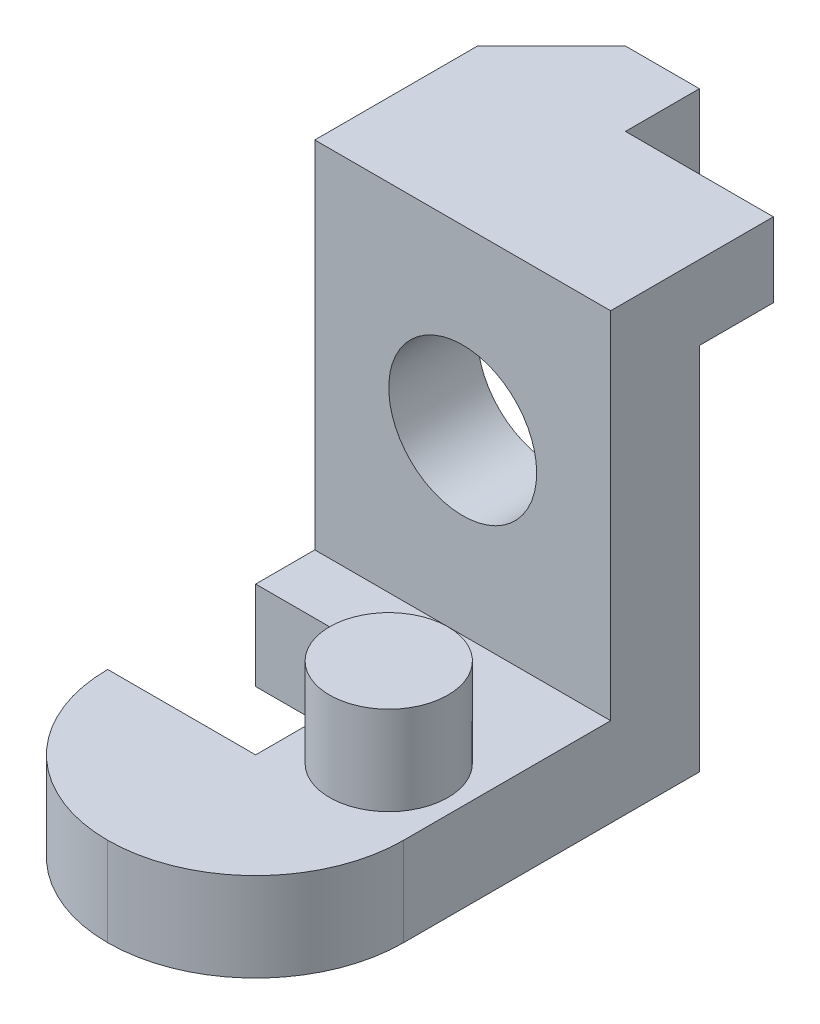
ISO-10303-21;
HEADER;
FILE_DESCRIPTION(('STEP AP214'),'2;1');
FILE_NAME('part.step','',(''),(''),'','','');
FILE_SCHEMA(('AUTOMOTIVE_DESIGN { 1 0 10303 214 1 1 1 1 }'));
ENDSEC;
DATA;
#1=APPLICATION_CONTEXT('core data for automotive mechanical design processes');
#2=APPLICATION_PROTOCOL_DEFINITION('international standard','automotive_design',2000,#1);
#3=PRODUCT_CONTEXT('',#1,'mechanical');
#4=PRODUCT('Part','Part','',(#3));
#5=PRODUCT_RELATED_PRODUCT_CATEGORY('part','',(#4));
#6=PRODUCT_DEFINITION_FORMATION('','',#4);
#7=PRODUCT_DEFINITION_CONTEXT('part definition',#1,'design');
#8=PRODUCT_DEFINITION('design','',#6,#7);
#9=PRODUCT_DEFINITION_SHAPE('','',#8);
#10=(LENGTH_UNIT() NAMED_UNIT(*) SI_UNIT(.MILLI.,.METRE.));
#11=(NAMED_UNIT(*) PLANE_ANGLE_UNIT() SI_UNIT($,.RADIAN.));
#12=(NAMED_UNIT(*) SI_UNIT($,.STERADIAN.) SOLID_ANGLE_UNIT());
#13=UNCERTAINTY_MEASURE_WITH_UNIT(LENGTH_MEASURE(1.E-05),#10,'distance_accuracy_value','');
#14=(GEOMETRIC_REPRESENTATION_CONTEXT(3) GLOBAL_UNCERTAINTY_ASSIGNED_CONTEXT((#13)) GLOBAL_UNIT_ASSIGNED_CONTEXT((#10,
#11,#12)) REPRESENTATION_CONTEXT('',''));
#15=CARTESIAN_POINT('',(0.,0.,0.));
#16=DIRECTION('',(0.,0.,1.));
#17=DIRECTION('',(1.,0.,0.));
#18=AXIS2_PLACEMENT_3D('',#15,#16,#17);
#19=CARTESIAN_POINT('',(12.7,38.1,-12.7));
#20=DIRECTION('',(0.,1.,0.));
#21=DIRECTION('',(0.,0.,1.));
#22=AXIS2_PLACEMENT_3D('',#19,#20,#21);
#23=CYLINDRICAL_SURFACE('',#22,12.7);
#24=DIRECTION('',(0.,1.,0.));
#25=VECTOR('',#24,1.);
#26=CARTESIAN_POINT('',(0.,38.1,-12.7));
#27=LINE('',#26,#25);
#28=CARTESIAN_POINT('',(0.,0.,-12.7));
#29=VERTEX_POINT('',#28);
#30=CARTESIAN_POINT('',(0.,7.62000000000001,-12.7));
#31=VERTEX_POINT('',#30);
#32=EDGE_CURVE('E56',#29,#31,#27,.T.);
#33=ORIENTED_EDGE('',*,*,#32,.F.);
#34=CARTESIAN_POINT('',(12.7,0.,-12.7));
#35=DIRECTION('',(0.,-1.,0.));
#36=DIRECTION('',(0.,0.,-1.));
#37=AXIS2_PLACEMENT_3D('',#34,#35,#36);
#38=CIRCLE('',#37,12.7);
#39=CARTESIAN_POINT('',(12.7,0.,0.));
#40=VERTEX_POINT('',#39);
#41=EDGE_CURVE('E160',#40,#29,#38,.T.);
#42=ORIENTED_EDGE('',*,*,#41,.F.);
#43=DIRECTION('',(0.,1.,0.));
#44=VECTOR('',#43,1.);
#45=CARTESIAN_POINT('',(12.7,38.1,0.));
#46=LINE('',#45,#44);
#47=CARTESIAN_POINT('',(12.7,7.62000000000001,0.));
#48=VERTEX_POINT('',#47);
#49=EDGE_CURVE('E183',#40,#48,#46,.T.);
#50=ORIENTED_EDGE('',*,*,#49,.T.);
#51=CARTESIAN_POINT('',(12.7,7.62000000000001,-12.7));
#52=DIRECTION('',(0.,-1.,0.));
#53=DIRECTION('',(0.,0.,-1.));
#54=AXIS2_PLACEMENT_3D('',#51,#52,#53);
#55=CIRCLE('',#54,12.7);
#56=EDGE_CURVE('E49',#31,#48,#55,.F.);
#57=ORIENTED_EDGE('',*,*,#56,.F.);
#58=EDGE_LOOP('',(#33,#42,#50,#57));
#59=FACE_BOUND('',#58,.T.);
#60=ADVANCED_FACE('F41',(#59),#23,.T.);
#61=CARTESIAN_POINT('',(12.7,38.1,-12.7));
#62=DIRECTION('',(0.,1.,0.));
#63=DIRECTION('',(0.,0.,1.));
#64=AXIS2_PLACEMENT_3D('',#61,#62,#63);
#65=CYLINDRICAL_SURFACE('',#64,12.7);
#66=ORIENTED_EDGE('',*,*,#49,.F.);
#67=CARTESIAN_POINT('',(12.7,0.,-12.7));
#68=DIRECTION('',(0.,-1.,0.));
#69=DIRECTION('',(0.,0.,-1.));
#70=AXIS2_PLACEMENT_3D('',#67,#68,#69);
#71=CIRCLE('',#70,12.7);
#72=CARTESIAN_POINT('',(25.4,0.,-12.7));
#73=VERTEX_POINT('',#72);
#74=EDGE_CURVE('E64',#73,#40,#71,.T.);
#75=ORIENTED_EDGE('',*,*,#74,.F.);
#76=DIRECTION('',(0.,1.,0.));
#77=VECTOR('',#76,1.);
#78=CARTESIAN_POINT('',(25.4,38.1,-12.7));
#79=LINE('',#78,#77);
#80=CARTESIAN_POINT('',(25.4,7.62000000000001,-12.7));
#81=VERTEX_POINT('',#80);
#82=EDGE_CURVE('E184',#81,#73,#79,.F.);
#83=ORIENTED_EDGE('',*,*,#82,.F.);
#84=CARTESIAN_POINT('',(12.7,7.62000000000001,-12.7));
#85=DIRECTION('',(0.,-1.,0.));
#86=DIRECTION('',(0.,0.,-1.));
#87=AXIS2_PLACEMENT_3D('',#84,#85,#86);
#88=CIRCLE('',#87,12.7);
#89=EDGE_CURVE('E170',#48,#81,#88,.F.);
#90=ORIENTED_EDGE('',*,*,#89,.F.);
#91=EDGE_LOOP('',(#66,#75,#83,#90));
#92=FACE_BOUND('',#91,.T.);
#93=ADVANCED_FACE('F182',(#92),#65,.T.);
#94=CARTESIAN_POINT('',(25.4,38.1,-50.8));
#95=DIRECTION('',(1.,0.,0.));
#96=DIRECTION('',(0.,0.,-1.));
#97=AXIS2_PLACEMENT_3D('',#94,#95,#96);
#98=PLANE('',#97);
#99=DIRECTION('',(0.,0.,-1.));
#100=VECTOR('',#99,1.);
#101=CARTESIAN_POINT('',(25.4,7.62000000000001,-30.48));
#102=LINE('',#101,#100);
#103=CARTESIAN_POINT('',(25.4,7.62000000000001,-30.48));
#104=VERTEX_POINT('',#103);
#105=EDGE_CURVE('E249',#81,#104,#102,.T.);
#106=ORIENTED_EDGE('',*,*,#105,.F.);
#107=ORIENTED_EDGE('',*,*,#82,.T.);
#108=DIRECTION('',(0.,0.,1.));
#109=VECTOR('',#108,1.);
#110=CARTESIAN_POINT('',(25.4,0.,-50.8));
#111=LINE('',#110,#109);
#112=CARTESIAN_POINT('',(25.4,0.,-38.1));
#113=VERTEX_POINT('',#112);
#114=EDGE_CURVE('E222',#113,#73,#111,.T.);
#115=ORIENTED_EDGE('',*,*,#114,.F.);
#116=DIRECTION('',(0.,-1.,0.));
#117=VECTOR('',#116,1.);
#118=CARTESIAN_POINT('',(25.4,38.1,-38.1));
#119=LINE('',#118,#117);
#120=CARTESIAN_POINT('',(25.4,31.7068356070592,-38.1));
#121=VERTEX_POINT('',#120);
#122=EDGE_CURVE('E261',#121,#113,#119,.T.);
#123=ORIENTED_EDGE('',*,*,#122,.F.);
#124=DIRECTION('',(0.,0.,1.));
#125=VECTOR('',#124,1.);
#126=CARTESIAN_POINT('',(25.4,31.7068356070592,-50.8));
#127=LINE('',#126,#125);
#128=CARTESIAN_POINT('',(25.4,31.7068356070592,-44.45));
#129=VERTEX_POINT('',#128);
#130=EDGE_CURVE('E250',#129,#121,#127,.T.);
#131=ORIENTED_EDGE('',*,*,#130,.F.);
#132=DIRECTION('',(0.,1.,0.));
#133=VECTOR('',#132,1.);
#134=CARTESIAN_POINT('',(25.4,5.84200000000001,-44.45));
#135=LINE('',#134,#133);
#136=CARTESIAN_POINT('',(25.4,38.1,-44.45));
#137=VERTEX_POINT('',#136);
#138=EDGE_CURVE('E274',#129,#137,#135,.T.);
#139=ORIENTED_EDGE('',*,*,#138,.T.);
#140=DIRECTION('',(0.,0.,1.));
#141=VECTOR('',#140,1.);
#142=CARTESIAN_POINT('',(25.4,38.1,-50.8));
#143=LINE('',#142,#141);
#144=CARTESIAN_POINT('',(25.4,38.1,-30.48));
#145=VERTEX_POINT('',#144);
#146=EDGE_CURVE('E221',#137,#145,#143,.T.);
#147=ORIENTED_EDGE('',*,*,#146,.T.);
#148=DIRECTION('',(0.,1.,0.));
#149=VECTOR('',#148,1.);
#150=CARTESIAN_POINT('',(25.4,7.62000000000001,-30.48));
#151=LINE('',#150,#149);
#152=EDGE_CURVE('E238',#104,#145,#151,.T.);
#153=ORIENTED_EDGE('',*,*,#152,.F.);
#154=EDGE_LOOP('',(#106,#107,#115,#123,#131,#139,#147,#153));
#155=FACE_BOUND('',#154,.T.);
#156=ADVANCED_FACE('F342',(#155),#98,.T.);
#157=CARTESIAN_POINT('',(0.,38.1,-50.8));
#158=DIRECTION('',(0.,0.,-1.));
#159=DIRECTION('',(-1.,0.,0.));
#160=AXIS2_PLACEMENT_3D('',#157,#158,#159);
#161=PLANE('',#160);
#162=DIRECTION('',(1.,0.,0.));
#163=VECTOR('',#162,1.);
#164=CARTESIAN_POINT('',(-10.668,31.7068356070592,-50.8));
#165=LINE('',#164,#163);
#166=CARTESIAN_POINT('',(6.35000000000001,31.7068356070592,-50.8));
#167=VERTEX_POINT('',#166);
#168=CARTESIAN_POINT('',(12.7,31.7068356070592,-50.8));
#169=VERTEX_POINT('',#168);
#170=EDGE_CURVE('E271',#167,#169,#165,.T.);
#171=ORIENTED_EDGE('',*,*,#170,.F.);
#172=DIRECTION('',(0.,1.,0.));
#173=VECTOR('',#172,1.);
#174=CARTESIAN_POINT('',(6.35000000000001,38.1,-50.8));
#175=LINE('',#174,#173);
#176=CARTESIAN_POINT('',(6.35000000000001,38.1,-50.8));
#177=VERTEX_POINT('',#176);
#178=EDGE_CURVE('E192',#167,#177,#175,.T.);
#179=ORIENTED_EDGE('',*,*,#178,.T.);
#180=DIRECTION('',(1.,0.,0.));
#181=VECTOR('',#180,1.);
#182=CARTESIAN_POINT('',(0.,38.1,-50.8));
#183=LINE('',#182,#181);
#184=CARTESIAN_POINT('',(12.7,38.1,-50.8));
#185=VERTEX_POINT('',#184);
#186=EDGE_CURVE('E232',#177,#185,#183,.T.);
#187=ORIENTED_EDGE('',*,*,#186,.T.);
#188=DIRECTION('',(0.,1.,0.));
#189=VECTOR('',#188,1.);
#190=CARTESIAN_POINT('',(12.7,5.84200000000001,-50.8));
#191=LINE('',#190,#189);
#192=EDGE_CURVE('E275',#169,#185,#191,.T.);
#193=ORIENTED_EDGE('',*,*,#192,.F.);
#194=EDGE_LOOP('',(#171,#179,#187,#193));
#195=FACE_BOUND('',#194,.T.);
#196=ADVANCED_FACE('F364',(#195),#161,.T.);
#197=CARTESIAN_POINT('',(0.,38.1,0.));
#198=DIRECTION('',(-1.,0.,0.));
#199=DIRECTION('',(0.,0.,1.));
#200=AXIS2_PLACEMENT_3D('',#197,#198,#199);
#201=PLANE('',#200);
#202=DIRECTION('',(0.,1.,0.));
#203=VECTOR('',#202,1.);
#204=CARTESIAN_POINT('',(0.,0.,-25.4));
#205=LINE('',#204,#203);
#206=CARTESIAN_POINT('',(0.,0.,-25.4));
#207=VERTEX_POINT('',#206);
#208=CARTESIAN_POINT('',(0.,7.62000000000001,-25.4));
#209=VERTEX_POINT('',#208);
#210=EDGE_CURVE('E301',#207,#209,#205,.T.);
#211=ORIENTED_EDGE('',*,*,#210,.T.);
#212=DIRECTION('',(0.,0.,1.));
#213=VECTOR('',#212,1.);
#214=CARTESIAN_POINT('',(0.,7.62000000000001,0.));
#215=LINE('',#214,#213);
#216=CARTESIAN_POINT('',(0.,7.62000000000001,-30.48));
#217=VERTEX_POINT('',#216);
#218=EDGE_CURVE('E242',#217,#209,#215,.T.);
#219=ORIENTED_EDGE('',*,*,#218,.F.);
#220=DIRECTION('',(0.,1.,0.));
#221=VECTOR('',#220,1.);
#222=CARTESIAN_POINT('',(0.,7.62000000000001,-30.48));
#223=LINE('',#222,#221);
#224=CARTESIAN_POINT('',(0.,38.1,-30.48));
#225=VERTEX_POINT('',#224);
#226=EDGE_CURVE('E229',#217,#225,#223,.T.);
#227=ORIENTED_EDGE('',*,*,#226,.T.);
#228=DIRECTION('',(0.,0.,-1.));
#229=VECTOR('',#228,1.);
#230=CARTESIAN_POINT('',(0.,38.1,0.));
#231=LINE('',#230,#229);
#232=CARTESIAN_POINT('',(0.,38.1,-44.45));
#233=VERTEX_POINT('',#232);
#234=EDGE_CURVE('E225',#225,#233,#231,.T.);
#235=ORIENTED_EDGE('',*,*,#234,.T.);
#236=DIRECTION('',(0.,-1.,0.));
#237=VECTOR('',#236,1.);
#238=CARTESIAN_POINT('',(0.,38.1,-44.45));
#239=LINE('',#238,#237);
#240=CARTESIAN_POINT('',(0.,31.7068356070592,-44.45));
#241=VERTEX_POINT('',#240);
#242=EDGE_CURVE('E201',#233,#241,#239,.T.);
#243=ORIENTED_EDGE('',*,*,#242,.T.);
#244=DIRECTION('',(0.,0.,-1.));
#245=VECTOR('',#244,1.);
#246=CARTESIAN_POINT('',(0.,31.7068356070592,0.));
#247=LINE('',#246,#245);
#248=CARTESIAN_POINT('',(0.,31.7068356070592,-38.1));
#249=VERTEX_POINT('',#248);
#250=EDGE_CURVE('E213',#249,#241,#247,.T.);
#251=ORIENTED_EDGE('',*,*,#250,.F.);
#252=DIRECTION('',(0.,1.,0.));
#253=VECTOR('',#252,1.);
#254=CARTESIAN_POINT('',(0.,38.1,-38.1));
#255=LINE('',#254,#253);
#256=CARTESIAN_POINT('',(0.,0.,-38.1));
#257=VERTEX_POINT('',#256);
#258=EDGE_CURVE('E264',#257,#249,#255,.T.);
#259=ORIENTED_EDGE('',*,*,#258,.F.);
#260=DIRECTION('',(0.,0.,-1.));
#261=VECTOR('',#260,1.);
#262=CARTESIAN_POINT('',(0.,0.,0.));
#263=LINE('',#262,#261);
#264=EDGE_CURVE('E226',#207,#257,#263,.T.);
#265=ORIENTED_EDGE('',*,*,#264,.F.);
#266=EDGE_LOOP('',(#211,#219,#227,#235,#243,#251,#259,#265));
#267=FACE_BOUND('',#266,.T.);
#268=ADVANCED_FACE('F334',(#267),#201,.T.);
#269=CARTESIAN_POINT('',(0.,38.1,0.));
#270=DIRECTION('',(0.,-1.,0.));
#271=DIRECTION('',(0.,0.,-1.));
#272=AXIS2_PLACEMENT_3D('',#269,#270,#271);
#273=PLANE('',#272);
#274=ORIENTED_EDGE('',*,*,#186,.F.);
#275=DIRECTION('',(0.707106781186548,0.,-0.707106781186547));
#276=VECTOR('',#275,1.);
#277=CARTESIAN_POINT('',(0.,38.1,-44.45));
#278=LINE('',#277,#276);
#279=EDGE_CURVE('E187',#177,#233,#278,.F.);
#280=ORIENTED_EDGE('',*,*,#279,.T.);
#281=ORIENTED_EDGE('',*,*,#234,.F.);
#282=DIRECTION('',(-1.,0.,0.));
#283=VECTOR('',#282,1.);
#284=CARTESIAN_POINT('',(0.,38.1,-30.48));
#285=LINE('',#284,#283);
#286=EDGE_CURVE('E246',#145,#225,#285,.T.);
#287=ORIENTED_EDGE('',*,*,#286,.F.);
#288=ORIENTED_EDGE('',*,*,#146,.F.);
#289=DIRECTION('',(1.,0.,0.));
#290=VECTOR('',#289,1.);
#291=CARTESIAN_POINT('',(12.7,38.1,-44.45));
#292=LINE('',#291,#290);
#293=CARTESIAN_POINT('',(12.7,38.1,-44.45));
#294=VERTEX_POINT('',#293);
#295=EDGE_CURVE('E280',#294,#137,#292,.T.);
#296=ORIENTED_EDGE('',*,*,#295,.F.);
#297=DIRECTION('',(0.,0.,1.));
#298=VECTOR('',#297,1.);
#299=CARTESIAN_POINT('',(12.7,38.1,-50.8));
#300=LINE('',#299,#298);
#301=EDGE_CURVE('E288',#185,#294,#300,.T.);
#302=ORIENTED_EDGE('',*,*,#301,.F.);
#303=EDGE_LOOP('',(#274,#280,#281,#287,#288,#296,#302));
#304=FACE_BOUND('',#303,.T.);
#305=ADVANCED_FACE('F348',(#304),#273,.F.);
#306=CARTESIAN_POINT('',(0.,0.,0.));
#307=DIRECTION('',(0.,-1.,0.));
#308=DIRECTION('',(0.,0.,-1.));
#309=AXIS2_PLACEMENT_3D('',#306,#307,#308);
#310=PLANE('',#309);
#311=DIRECTION('',(-1.,0.,0.));
#312=VECTOR('',#311,1.);
#313=CARTESIAN_POINT('',(12.7,0.,-25.4));
#314=LINE('',#313,#312);
#315=CARTESIAN_POINT('',(12.7,0.,-25.4));
#316=VERTEX_POINT('',#315);
#317=EDGE_CURVE('E308',#316,#207,#314,.T.);
#318=ORIENTED_EDGE('',*,*,#317,.T.);
#319=ORIENTED_EDGE('',*,*,#264,.T.);
#320=DIRECTION('',(-1.,0.,0.));
#321=VECTOR('',#320,1.);
#322=CARTESIAN_POINT('',(0.,0.,-38.1));
#323=LINE('',#322,#321);
#324=EDGE_CURVE('E217',#113,#257,#323,.T.);
#325=ORIENTED_EDGE('',*,*,#324,.F.);
#326=ORIENTED_EDGE('',*,*,#114,.T.);
#327=ORIENTED_EDGE('',*,*,#74,.T.);
#328=ORIENTED_EDGE('',*,*,#41,.T.);
#329=DIRECTION('',(1.,0.,0.));
#330=VECTOR('',#329,1.);
#331=CARTESIAN_POINT('',(0.,0.,-12.7));
#332=LINE('',#331,#330);
#333=CARTESIAN_POINT('',(12.7,0.,-12.7));
#334=VERTEX_POINT('',#333);
#335=EDGE_CURVE('E149',#29,#334,#332,.T.);
#336=ORIENTED_EDGE('',*,*,#335,.T.);
#337=DIRECTION('',(0.,0.,-1.));
#338=VECTOR('',#337,1.);
#339=CARTESIAN_POINT('',(12.7,0.,-12.7));
#340=LINE('',#339,#338);
#341=EDGE_CURVE('E157',#334,#316,#340,.T.);
#342=ORIENTED_EDGE('',*,*,#341,.T.);
#343=EDGE_LOOP('',(#318,#319,#325,#326,#327,#328,#336,#342));
#344=FACE_BOUND('',#343,.T.);
#345=ADVANCED_FACE('F162',(#344),#310,.T.);
#346=CARTESIAN_POINT('',(0.,7.62000000000001,-30.48));
#347=DIRECTION('',(0.,0.,-1.));
#348=DIRECTION('',(-1.,0.,0.));
#349=AXIS2_PLACEMENT_3D('',#346,#347,#348);
#350=PLANE('',#349);
#351=CARTESIAN_POINT('',(12.7,22.86,-30.48));
#352=DIRECTION('',(0.,0.,1.));
#353=DIRECTION('',(1.,0.,0.));
#354=AXIS2_PLACEMENT_3D('',#351,#352,#353);
#355=CIRCLE('',#354,6.35);
#356=CARTESIAN_POINT('',(19.05,22.86,-30.48));
#357=VERTEX_POINT('',#356);
#358=EDGE_CURVE('E297',#357,#357,#355,.T.);
#359=ORIENTED_EDGE('',*,*,#358,.F.);
#360=EDGE_LOOP('',(#359));
#361=FACE_BOUND('',#360,.T.);
#362=ORIENTED_EDGE('',*,*,#286,.T.);
#363=ORIENTED_EDGE('',*,*,#226,.F.);
#364=DIRECTION('',(-1.,0.,0.));
#365=VECTOR('',#364,1.);
#366=CARTESIAN_POINT('',(0.,7.62000000000001,-30.48));
#367=LINE('',#366,#365);
#368=EDGE_CURVE('E253',#104,#217,#367,.T.);
#369=ORIENTED_EDGE('',*,*,#368,.F.);
#370=ORIENTED_EDGE('',*,*,#152,.T.);
#371=EDGE_LOOP('',(#362,#363,#369,#370));
#372=FACE_BOUND('',#371,.T.);
#373=ADVANCED_FACE('F339',(#361,#372),#350,.F.);
#374=CARTESIAN_POINT('',(0.,7.62000000000001,0.));
#375=DIRECTION('',(0.,-1.,0.));
#376=DIRECTION('',(0.,0.,-1.));
#377=AXIS2_PLACEMENT_3D('',#374,#375,#376);
#378=PLANE('',#377);
#379=CARTESIAN_POINT('',(19.05,7.62000000000001,-17.78));
#380=DIRECTION('',(0.,-1.,0.));
#381=DIRECTION('',(0.,0.,-1.));
#382=AXIS2_PLACEMENT_3D('',#379,#380,#381);
#383=CIRCLE('',#382,5.08);
#384=CARTESIAN_POINT('',(19.05,7.62000000000001,-22.86));
#385=VERTEX_POINT('',#384);
#386=EDGE_CURVE('E11',#385,#385,#383,.F.);
#387=ORIENTED_EDGE('',*,*,#386,.F.);
#388=EDGE_LOOP('',(#387));
#389=FACE_BOUND('',#388,.T.);
#390=ORIENTED_EDGE('',*,*,#218,.T.);
#391=DIRECTION('',(-1.,0.,0.));
#392=VECTOR('',#391,1.);
#393=CARTESIAN_POINT('',(12.7,7.62000000000001,-25.4));
#394=LINE('',#393,#392);
#395=CARTESIAN_POINT('',(12.7,7.62000000000001,-25.4));
#396=VERTEX_POINT('',#395);
#397=EDGE_CURVE('E158',#396,#209,#394,.T.);
#398=ORIENTED_EDGE('',*,*,#397,.F.);
#399=DIRECTION('',(0.,0.,-1.));
#400=VECTOR('',#399,1.);
#401=CARTESIAN_POINT('',(12.7,7.62000000000001,-12.7));
#402=LINE('',#401,#400);
#403=CARTESIAN_POINT('',(12.7,7.62000000000001,-12.7));
#404=VERTEX_POINT('',#403);
#405=EDGE_CURVE('E316',#404,#396,#402,.T.);
#406=ORIENTED_EDGE('',*,*,#405,.F.);
#407=DIRECTION('',(1.,0.,0.));
#408=VECTOR('',#407,1.);
#409=CARTESIAN_POINT('',(0.,7.62000000000001,-12.7));
#410=LINE('',#409,#408);
#411=EDGE_CURVE('E181',#31,#404,#410,.T.);
#412=ORIENTED_EDGE('',*,*,#411,.F.);
#413=ORIENTED_EDGE('',*,*,#56,.T.);
#414=ORIENTED_EDGE('',*,*,#89,.T.);
#415=ORIENTED_EDGE('',*,*,#105,.T.);
#416=ORIENTED_EDGE('',*,*,#368,.T.);
#417=EDGE_LOOP('',(#390,#398,#406,#412,#413,#414,#415,#416));
#418=FACE_BOUND('',#417,.T.);
#419=ADVANCED_FACE('F179',(#389,#418),#378,.F.);
#420=CARTESIAN_POINT('',(-10.668,0.,-38.1));
#421=DIRECTION('',(0.,0.,1.));
#422=DIRECTION('',(0.,-1.,0.));
#423=AXIS2_PLACEMENT_3D('',#420,#421,#422);
#424=PLANE('',#423);
#425=CARTESIAN_POINT('',(12.7,22.86,-38.1));
#426=DIRECTION('',(0.,0.,1.));
#427=DIRECTION('',(1.,0.,0.));
#428=AXIS2_PLACEMENT_3D('',#425,#426,#427);
#429=CIRCLE('',#428,6.35);
#430=CARTESIAN_POINT('',(19.05,22.86,-38.1));
#431=VERTEX_POINT('',#430);
#432=EDGE_CURVE('E296',#431,#431,#429,.T.);
#433=ORIENTED_EDGE('',*,*,#432,.T.);
#434=EDGE_LOOP('',(#433));
#435=FACE_BOUND('',#434,.T.);
#436=ORIENTED_EDGE('',*,*,#122,.T.);
#437=ORIENTED_EDGE('',*,*,#324,.T.);
#438=ORIENTED_EDGE('',*,*,#258,.T.);
#439=DIRECTION('',(1.,0.,0.));
#440=VECTOR('',#439,1.);
#441=CARTESIAN_POINT('',(-10.668,31.7068356070592,-38.1));
#442=LINE('',#441,#440);
#443=EDGE_CURVE('E267',#249,#121,#442,.T.);
#444=ORIENTED_EDGE('',*,*,#443,.T.);
#445=EDGE_LOOP('',(#436,#437,#438,#444));
#446=FACE_BOUND('',#445,.T.);
#447=ADVANCED_FACE('F373',(#435,#446),#424,.F.);
#448=CARTESIAN_POINT('',(-10.668,31.7068356070592,0.));
#449=DIRECTION('',(0.,1.,0.));
#450=DIRECTION('',(0.,0.,1.));
#451=AXIS2_PLACEMENT_3D('',#448,#449,#450);
#452=PLANE('',#451);
#453=ORIENTED_EDGE('',*,*,#250,.T.);
#454=DIRECTION('',(-0.707106781186548,0.,0.707106781186547));
#455=VECTOR('',#454,1.);
#456=CARTESIAN_POINT('',(0.,31.7068356070592,-44.45));
#457=LINE('',#456,#455);
#458=EDGE_CURVE('E198',#241,#167,#457,.F.);
#459=ORIENTED_EDGE('',*,*,#458,.T.);
#460=ORIENTED_EDGE('',*,*,#170,.T.);
#461=DIRECTION('',(0.,0.,1.));
#462=VECTOR('',#461,1.);
#463=CARTESIAN_POINT('',(12.7,31.7068356070592,0.));
#464=LINE('',#463,#462);
#465=CARTESIAN_POINT('',(12.7,31.7068356070592,-44.45));
#466=VERTEX_POINT('',#465);
#467=EDGE_CURVE('E209',#169,#466,#464,.T.);
#468=ORIENTED_EDGE('',*,*,#467,.T.);
#469=DIRECTION('',(1.,0.,0.));
#470=VECTOR('',#469,1.);
#471=CARTESIAN_POINT('',(-10.668,31.7068356070592,-44.45));
#472=LINE('',#471,#470);
#473=EDGE_CURVE('E205',#466,#129,#472,.T.);
#474=ORIENTED_EDGE('',*,*,#473,.T.);
#475=ORIENTED_EDGE('',*,*,#130,.T.);
#476=ORIENTED_EDGE('',*,*,#443,.F.);
#477=EDGE_LOOP('',(#453,#459,#460,#468,#474,#475,#476));
#478=FACE_BOUND('',#477,.T.);
#479=ADVANCED_FACE('F359',(#478),#452,.F.);
#480=CARTESIAN_POINT('',(12.7,5.84200000000001,-44.45));
#481=DIRECTION('',(0.,0.,1.));
#482=DIRECTION('',(1.,0.,0.));
#483=AXIS2_PLACEMENT_3D('',#480,#481,#482);
#484=PLANE('',#483);
#485=DIRECTION('',(0.,1.,0.));
#486=VECTOR('',#485,1.);
#487=CARTESIAN_POINT('',(12.7,5.84200000000001,-44.45));
#488=LINE('',#487,#486);
#489=EDGE_CURVE('E279',#466,#294,#488,.T.);
#490=ORIENTED_EDGE('',*,*,#489,.T.);
#491=ORIENTED_EDGE('',*,*,#295,.T.);
#492=ORIENTED_EDGE('',*,*,#138,.F.);
#493=ORIENTED_EDGE('',*,*,#473,.F.);
#494=EDGE_LOOP('',(#490,#491,#492,#493));
#495=FACE_BOUND('',#494,.T.);
#496=ADVANCED_FACE('F381',(#495),#484,.F.);
#497=CARTESIAN_POINT('',(12.7,5.84200000000001,-50.8));
#498=DIRECTION('',(-1.,0.,0.));
#499=DIRECTION('',(0.,0.,1.));
#500=AXIS2_PLACEMENT_3D('',#497,#498,#499);
#501=PLANE('',#500);
#502=ORIENTED_EDGE('',*,*,#192,.T.);
#503=ORIENTED_EDGE('',*,*,#301,.T.);
#504=ORIENTED_EDGE('',*,*,#489,.F.);
#505=ORIENTED_EDGE('',*,*,#467,.F.);
#506=EDGE_LOOP('',(#502,#503,#504,#505));
#507=FACE_BOUND('',#506,.T.);
#508=ADVANCED_FACE('F366',(#507),#501,.F.);
#509=CARTESIAN_POINT('',(0.,38.1,-44.45));
#510=DIRECTION('',(0.707106781186547,0.,0.707106781186548));
#511=DIRECTION('',(0.,-1.,0.));
#512=AXIS2_PLACEMENT_3D('',#509,#510,#511);
#513=PLANE('',#512);
#514=ORIENTED_EDGE('',*,*,#279,.F.);
#515=ORIENTED_EDGE('',*,*,#178,.F.);
#516=ORIENTED_EDGE('',*,*,#458,.F.);
#517=ORIENTED_EDGE('',*,*,#242,.F.);
#518=EDGE_LOOP('',(#514,#515,#516,#517));
#519=FACE_BOUND('',#518,.T.);
#520=ADVANCED_FACE('F355',(#519),#513,.F.);
#521=CARTESIAN_POINT('',(19.05,15.24,-17.78));
#522=DIRECTION('',(0.,-1.,0.));
#523=DIRECTION('',(0.,0.,-1.));
#524=AXIS2_PLACEMENT_3D('',#521,#522,#523);
#525=CYLINDRICAL_SURFACE('',#524,5.08);
#526=CARTESIAN_POINT('',(19.05,15.24,-17.78));
#527=DIRECTION('',(0.,1.,0.));
#528=DIRECTION('',(0.,0.,1.));
#529=AXIS2_PLACEMENT_3D('',#526,#527,#528);
#530=CIRCLE('',#529,5.08);
#531=CARTESIAN_POINT('',(19.05,15.24,-22.86));
#532=VERTEX_POINT('',#531);
#533=EDGE_CURVE('E292',#532,#532,#530,.T.);
#534=CARTESIAN_POINT('',(19.05,15.24,-22.86));
#535=CARTESIAN_POINT('',(19.05,15.160625,-22.86));
#536=CARTESIAN_POINT('',(19.05,15.08125,-22.86));
#537=CARTESIAN_POINT('',(19.05,14.9225,-22.86));
#538=CARTESIAN_POINT('',(19.05,14.843125,-22.86));
#539=CARTESIAN_POINT('',(19.05,14.684375,-22.86));
#540=CARTESIAN_POINT('',(19.05,14.605,-22.86));
#541=CARTESIAN_POINT('',(19.05,14.44625,-22.86));
#542=CARTESIAN_POINT('',(19.05,14.366875,-22.86));
#543=CARTESIAN_POINT('',(19.05,14.208125,-22.86));
#544=CARTESIAN_POINT('',(19.05,14.12875,-22.86));
#545=CARTESIAN_POINT('',(19.05,13.97,-22.86));
#546=CARTESIAN_POINT('',(19.05,13.890625,-22.86));
#547=CARTESIAN_POINT('',(19.05,13.731875,-22.86));
#548=CARTESIAN_POINT('',(19.05,13.6525,-22.86));
#549=CARTESIAN_POINT('',(19.05,13.49375,-22.86));
#550=CARTESIAN_POINT('',(19.05,13.414375,-22.86));
#551=CARTESIAN_POINT('',(19.05,13.255625,-22.86));
#552=CARTESIAN_POINT('',(19.05,13.17625,-22.86));
#553=CARTESIAN_POINT('',(19.05,13.0175,-22.86));
#554=CARTESIAN_POINT('',(19.05,12.938125,-22.86));
#555=CARTESIAN_POINT('',(19.05,12.779375,-22.86));
#556=CARTESIAN_POINT('',(19.05,12.7,-22.86));
#557=CARTESIAN_POINT('',(19.05,12.54125,-22.86));
#558=CARTESIAN_POINT('',(19.05,12.461875,-22.86));
#559=CARTESIAN_POINT('',(19.05,12.303125,-22.86));
#560=CARTESIAN_POINT('',(19.05,12.22375,-22.86));
#561=CARTESIAN_POINT('',(19.05,12.065,-22.86));
#562=CARTESIAN_POINT('',(19.05,11.985625,-22.86));
#563=CARTESIAN_POINT('',(19.05,11.826875,-22.86));
#564=CARTESIAN_POINT('',(19.05,11.7475,-22.86));
#565=CARTESIAN_POINT('',(19.05,11.58875,-22.86));
#566=CARTESIAN_POINT('',(19.05,11.509375,-22.86));
#567=CARTESIAN_POINT('',(19.05,11.350625,-22.86));
#568=CARTESIAN_POINT('',(19.05,11.27125,-22.86));
#569=CARTESIAN_POINT('',(19.05,11.1125,-22.86));
#570=CARTESIAN_POINT('',(19.05,11.033125,-22.86));
#571=CARTESIAN_POINT('',(19.05,10.874375,-22.86));
#572=CARTESIAN_POINT('',(19.05,10.795,-22.86));
#573=CARTESIAN_POINT('',(19.05,10.63625,-22.86));
#574=CARTESIAN_POINT('',(19.05,10.556875,-22.86));
#575=CARTESIAN_POINT('',(19.05,10.398125,-22.86));
#576=CARTESIAN_POINT('',(19.05,10.31875,-22.86));
#577=CARTESIAN_POINT('',(19.05,10.16,-22.86));
#578=CARTESIAN_POINT('',(19.05,10.080625,-22.86));
#579=CARTESIAN_POINT('',(19.05,9.92187500000001,-22.86));
#580=CARTESIAN_POINT('',(19.05,9.8425,-22.86));
#581=CARTESIAN_POINT('',(19.05,9.68375000000001,-22.86));
#582=CARTESIAN_POINT('',(19.05,9.604375,-22.86));
#583=CARTESIAN_POINT('',(19.05,9.44562500000001,-22.86));
#584=CARTESIAN_POINT('',(19.05,9.36625,-22.86));
#585=CARTESIAN_POINT('',(19.05,9.2075,-22.86));
#586=CARTESIAN_POINT('',(19.05,9.128125,-22.86));
#587=CARTESIAN_POINT('',(19.05,8.969375,-22.86));
#588=CARTESIAN_POINT('',(19.05,8.89000000000001,-22.86));
#589=CARTESIAN_POINT('',(19.05,8.73125000000001,-22.86));
#590=CARTESIAN_POINT('',(19.05,8.65187500000001,-22.86));
#591=CARTESIAN_POINT('',(19.05,8.49312500000001,-22.86));
#592=CARTESIAN_POINT('',(19.05,8.41375,-22.86));
#593=CARTESIAN_POINT('',(19.05,8.25500000000001,-22.86));
#594=CARTESIAN_POINT('',(19.05,8.17562500000001,-22.86));
#595=CARTESIAN_POINT('',(19.05,8.01687500000001,-22.86));
#596=CARTESIAN_POINT('',(19.05,7.93750000000001,-22.86));
#597=CARTESIAN_POINT('',(19.05,7.77875000000001,-22.86));
#598=CARTESIAN_POINT('',(19.05,7.69937500000001,-22.86));
#599=CARTESIAN_POINT('',(19.05,7.62000000000001,-22.86));
#600=B_SPLINE_CURVE_WITH_KNOTS('',3,(#534,#535,#536,#537,#538,#539,#540,#541,#542,#543,#544,
#545,#546,#547,#548,#549,#550,#551,#552,#553,#554,#555,#556,#557,#558,#559,#560,#561,#562,#563,
#564,#565,#566,#567,#568,#569,#570,#571,#572,#573,#574,#575,#576,#577,#578,#579,#580,#581,#582,
#583,#584,#585,#586,#587,#588,#589,#590,#591,#592,#593,#594,#595,#596,#597,#598,#599),
.UNSPECIFIED.,.F.,.F.,(4,2,2,2,2,2,2,2,2,2,2,2,2,2,2,2,2,2,2,2,2,2,2,2,2,2,2,2,2,2,2,2,4),(0.,
0.238125,0.476250000000001,0.714375,0.9525,1.190625,1.42875,1.666875,1.905,2.143125,2.38125,
2.619375,2.8575,3.095625,3.33375,3.571875,3.81,4.048125,4.28625,4.524375,4.7625,5.000625,
5.23875,5.476875,5.715,5.953125,6.19125,6.429375,6.6675,6.905625,7.14375,7.381875,7.62),.UNSPECIFIED.);
#601=EDGE_CURVE('BSEAM396',#532,#385,#600,.T.);
#602=ORIENTED_EDGE('',*,*,#533,.F.);
#603=ORIENTED_EDGE('',*,*,#386,.T.);
#604=ORIENTED_EDGE('',*,*,#601,.T.);
#605=ORIENTED_EDGE('',*,*,#601,.F.);
#606=EDGE_LOOP('',(#602,#604,#603,#605));
#607=FACE_BOUND('',#606,.T.);
#608=ADVANCED_FACE('F396',(#607),#525,.T.);
#609=CARTESIAN_POINT('',(0.,15.24,0.));
#610=DIRECTION('',(0.,1.,0.));
#611=DIRECTION('',(0.,0.,1.));
#612=AXIS2_PLACEMENT_3D('',#609,#610,#611);
#613=PLANE('',#612);
#614=ORIENTED_EDGE('',*,*,#533,.T.);
#615=EDGE_LOOP('',(#614));
#616=FACE_BOUND('',#615,.T.);
#617=ADVANCED_FACE('F413',(#616),#613,.T.);
#618=CARTESIAN_POINT('',(12.7,22.86,-38.1));
#619=DIRECTION('',(0.,0.,1.));
#620=DIRECTION('',(1.,0.,0.));
#621=AXIS2_PLACEMENT_3D('',#618,#619,#620);
#622=CYLINDRICAL_SURFACE('',#621,6.35);
#623=CARTESIAN_POINT('',(19.05,22.86,-38.1));
#624=CARTESIAN_POINT('',(19.05,22.86,-38.020625));
#625=CARTESIAN_POINT('',(19.05,22.86,-37.94125));
#626=CARTESIAN_POINT('',(19.05,22.86,-37.7825));
#627=CARTESIAN_POINT('',(19.05,22.86,-37.703125));
#628=CARTESIAN_POINT('',(19.05,22.86,-37.544375));
#629=CARTESIAN_POINT('',(19.05,22.86,-37.465));
#630=CARTESIAN_POINT('',(19.05,22.86,-37.30625));
#631=CARTESIAN_POINT('',(19.05,22.86,-37.226875));
#632=CARTESIAN_POINT('',(19.05,22.86,-37.068125));
#633=CARTESIAN_POINT('',(19.05,22.86,-36.98875));
#634=CARTESIAN_POINT('',(19.05,22.86,-36.83));
#635=CARTESIAN_POINT('',(19.05,22.86,-36.750625));
#636=CARTESIAN_POINT('',(19.05,22.86,-36.591875));
#637=CARTESIAN_POINT('',(19.05,22.86,-36.5125));
#638=CARTESIAN_POINT('',(19.05,22.86,-36.35375));
#639=CARTESIAN_POINT('',(19.05,22.86,-36.274375));
#640=CARTESIAN_POINT('',(19.05,22.86,-36.115625));
#641=CARTESIAN_POINT('',(19.05,22.86,-36.03625));
#642=CARTESIAN_POINT('',(19.05,22.86,-35.8775));
#643=CARTESIAN_POINT('',(19.05,22.86,-35.798125));
#644=CARTESIAN_POINT('',(19.05,22.86,-35.639375));
#645=CARTESIAN_POINT('',(19.05,22.86,-35.56));
#646=CARTESIAN_POINT('',(19.05,22.86,-35.40125));
#647=CARTESIAN_POINT('',(19.05,22.86,-35.321875));
#648=CARTESIAN_POINT('',(19.05,22.86,-35.163125));
#649=CARTESIAN_POINT('',(19.05,22.86,-35.08375));
#650=CARTESIAN_POINT('',(19.05,22.86,-34.925));
#651=CARTESIAN_POINT('',(19.05,22.86,-34.845625));
#652=CARTESIAN_POINT('',(19.05,22.86,-34.686875));
#653=CARTESIAN_POINT('',(19.05,22.86,-34.6075));
#654=CARTESIAN_POINT('',(19.05,22.86,-34.44875));
#655=CARTESIAN_POINT('',(19.05,22.86,-34.369375));
#656=CARTESIAN_POINT('',(19.05,22.86,-34.210625));
#657=CARTESIAN_POINT('',(19.05,22.86,-34.13125));
#658=CARTESIAN_POINT('',(19.05,22.86,-33.9725));
#659=CARTESIAN_POINT('',(19.05,22.86,-33.893125));
#660=CARTESIAN_POINT('',(19.05,22.86,-33.734375));
#661=CARTESIAN_POINT('',(19.05,22.86,-33.655));
#662=CARTESIAN_POINT('',(19.05,22.86,-33.49625));
#663=CARTESIAN_POINT('',(19.05,22.86,-33.416875));
#664=CARTESIAN_POINT('',(19.05,22.86,-33.258125));
#665=CARTESIAN_POINT('',(19.05,22.86,-33.17875));
#666=CARTESIAN_POINT('',(19.05,22.86,-33.02));
#667=CARTESIAN_POINT('',(19.05,22.86,-32.940625));
#668=CARTESIAN_POINT('',(19.05,22.86,-32.781875));
#669=CARTESIAN_POINT('',(19.05,22.86,-32.7025));
#670=CARTESIAN_POINT('',(19.05,22.86,-32.54375));
#671=CARTESIAN_POINT('',(19.05,22.86,-32.464375));
#672=CARTESIAN_POINT('',(19.05,22.86,-32.305625));
#673=CARTESIAN_POINT('',(19.05,22.86,-32.22625));
#674=CARTESIAN_POINT('',(19.05,22.86,-32.0675));
#675=CARTESIAN_POINT('',(19.05,22.86,-31.988125));
#676=CARTESIAN_POINT('',(19.05,22.86,-31.829375));
#677=CARTESIAN_POINT('',(19.05,22.86,-31.75));
#678=CARTESIAN_POINT('',(19.05,22.86,-31.59125));
#679=CARTESIAN_POINT('',(19.05,22.86,-31.511875));
#680=CARTESIAN_POINT('',(19.05,22.86,-31.353125));
#681=CARTESIAN_POINT('',(19.05,22.86,-31.27375));
#682=CARTESIAN_POINT('',(19.05,22.86,-31.115));
#683=CARTESIAN_POINT('',(19.05,22.86,-31.035625));
#684=CARTESIAN_POINT('',(19.05,22.86,-30.876875));
#685=CARTESIAN_POINT('',(19.05,22.86,-30.7975));
#686=CARTESIAN_POINT('',(19.05,22.86,-30.63875));
#687=CARTESIAN_POINT('',(19.05,22.86,-30.559375));
#688=CARTESIAN_POINT('',(19.05,22.86,-30.48));
#689=B_SPLINE_CURVE_WITH_KNOTS('',3,(#623,#624,#625,#626,#627,#628,#629,#630,#631,#632,#633,
#634,#635,#636,#637,#638,#639,#640,#641,#642,#643,#644,#645,#646,#647,#648,#649,#650,#651,#652,
#653,#654,#655,#656,#657,#658,#659,#660,#661,#662,#663,#664,#665,#666,#667,#668,#669,#670,#671,
#672,#673,#674,#675,#676,#677,#678,#679,#680,#681,#682,#683,#684,#685,#686,#687,#688),
.UNSPECIFIED.,.F.,.F.,(4,2,2,2,2,2,2,2,2,2,2,2,2,2,2,2,2,2,2,2,2,2,2,2,2,2,2,2,2,2,2,2,4),(0.,
0.238125000000006,0.476250000000004,0.714375000000003,0.952500000000002,1.190625,
1.42875000000001,1.66687500000001,1.905,2.143125,2.38125,2.619375,2.85750000000001,3.095625,
3.33375,3.571875,3.81,4.04812500000001,4.28625000000001,4.524375,4.7625,5.000625,
5.23875000000001,5.47687500000001,5.71500000000001,5.953125,6.19125,6.429375,6.66750000000001,
6.90562500000001,7.14375,7.381875,7.62000000000001),.UNSPECIFIED.);
#690=EDGE_CURVE('BSEAM411',#431,#357,#689,.T.);
#691=ORIENTED_EDGE('',*,*,#432,.F.);
#692=ORIENTED_EDGE('',*,*,#358,.T.);
#693=ORIENTED_EDGE('',*,*,#690,.T.);
#694=ORIENTED_EDGE('',*,*,#690,.F.);
#695=EDGE_LOOP('',(#691,#693,#692,#694));
#696=FACE_BOUND('',#695,.T.);
#697=ADVANCED_FACE('F411',(#696),#622,.F.);
#698=CARTESIAN_POINT('',(12.7,0.,-25.4));
#699=DIRECTION('',(0.,0.,-1.));
#700=DIRECTION('',(-1.,0.,0.));
#701=AXIS2_PLACEMENT_3D('',#698,#699,#700);
#702=PLANE('',#701);
#703=ORIENTED_EDGE('',*,*,#397,.T.);
#704=ORIENTED_EDGE('',*,*,#210,.F.);
#705=ORIENTED_EDGE('',*,*,#317,.F.);
#706=DIRECTION('',(0.,1.,0.));
#707=VECTOR('',#706,1.);
#708=CARTESIAN_POINT('',(12.7,0.,-25.4));
#709=LINE('',#708,#707);
#710=EDGE_CURVE('E307',#316,#396,#709,.T.);
#711=ORIENTED_EDGE('',*,*,#710,.T.);
#712=EDGE_LOOP('',(#703,#704,#705,#711));
#713=FACE_BOUND('',#712,.T.);
#714=ADVANCED_FACE('F331',(#713),#702,.F.);
#715=CARTESIAN_POINT('',(12.7,0.,-12.7));
#716=DIRECTION('',(1.,0.,0.));
#717=DIRECTION('',(0.,0.,-1.));
#718=AXIS2_PLACEMENT_3D('',#715,#716,#717);
#719=PLANE('',#718);
#720=ORIENTED_EDGE('',*,*,#405,.T.);
#721=ORIENTED_EDGE('',*,*,#710,.F.);
#722=ORIENTED_EDGE('',*,*,#341,.F.);
#723=DIRECTION('',(0.,1.,0.));
#724=VECTOR('',#723,1.);
#725=CARTESIAN_POINT('',(12.7,0.,-12.7));
#726=LINE('',#725,#724);
#727=EDGE_CURVE('E152',#334,#404,#726,.T.);
#728=ORIENTED_EDGE('',*,*,#727,.T.);
#729=EDGE_LOOP('',(#720,#721,#722,#728));
#730=FACE_BOUND('',#729,.T.);
#731=ADVANCED_FACE('F328',(#730),#719,.F.);
#732=CARTESIAN_POINT('',(0.,0.,-12.7));
#733=DIRECTION('',(0.,0.,1.));
#734=DIRECTION('',(1.,0.,0.));
#735=AXIS2_PLACEMENT_3D('',#732,#733,#734);
#736=PLANE('',#735);
#737=ORIENTED_EDGE('',*,*,#411,.T.);
#738=ORIENTED_EDGE('',*,*,#727,.F.);
#739=ORIENTED_EDGE('',*,*,#335,.F.);
#740=ORIENTED_EDGE('',*,*,#32,.T.);
#741=EDGE_LOOP('',(#737,#738,#739,#740));
#742=FACE_BOUND('',#741,.T.);
#743=ADVANCED_FACE('F151',(#742),#736,.F.);
#744=CLOSED_SHELL('',(#60,#93,#156,#196,#268,#305,#345,#373,#419,#447,#479,#496,#508,#520,#608,
#617,#697,#714,#731,#743));
#745=MANIFOLD_SOLID_BREP('B2',#744);
#746=ADVANCED_BREP_SHAPE_REPRESENTATION('',(#18,#745),#14);
#747=SHAPE_DEFINITION_REPRESENTATION(#9,#746);
ENDSEC;
END-ISO-10303-21;
